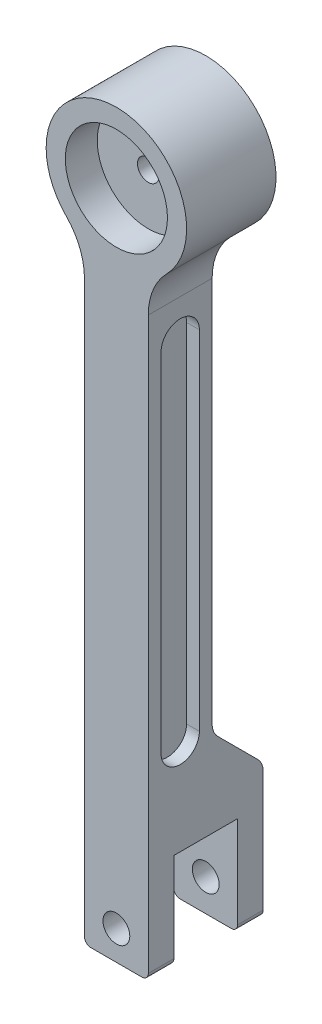
ISO-10303-21;
HEADER;
FILE_DESCRIPTION(('STEP AP214'),'2;1');
FILE_NAME('part.step','',(''),(''),'','','');
FILE_SCHEMA(('AUTOMOTIVE_DESIGN { 1 0 10303 214 1 1 1 1 }'));
ENDSEC;
DATA;
#1=APPLICATION_CONTEXT('core data for automotive mechanical design processes');
#2=APPLICATION_PROTOCOL_DEFINITION('international standard','automotive_design',2000,#1);
#3=PRODUCT_CONTEXT('',#1,'mechanical');
#4=PRODUCT('Part','Part','',(#3));
#5=PRODUCT_RELATED_PRODUCT_CATEGORY('part','',(#4));
#6=PRODUCT_DEFINITION_FORMATION('','',#4);
#7=PRODUCT_DEFINITION_CONTEXT('part definition',#1,'design');
#8=PRODUCT_DEFINITION('design','',#6,#7);
#9=PRODUCT_DEFINITION_SHAPE('','',#8);
#10=(LENGTH_UNIT() NAMED_UNIT(*) SI_UNIT(.MILLI.,.METRE.));
#11=(NAMED_UNIT(*) PLANE_ANGLE_UNIT() SI_UNIT($,.RADIAN.));
#12=(NAMED_UNIT(*) SI_UNIT($,.STERADIAN.) SOLID_ANGLE_UNIT());
#13=UNCERTAINTY_MEASURE_WITH_UNIT(LENGTH_MEASURE(1.E-05),#10,'distance_accuracy_value','');
#14=(GEOMETRIC_REPRESENTATION_CONTEXT(3) GLOBAL_UNCERTAINTY_ASSIGNED_CONTEXT((#13)) GLOBAL_UNIT_ASSIGNED_CONTEXT((#10,
#11,#12)) REPRESENTATION_CONTEXT('',''));
#15=CARTESIAN_POINT('',(0.,0.,0.));
#16=DIRECTION('',(0.,0.,1.));
#17=DIRECTION('',(1.,0.,0.));
#18=AXIS2_PLACEMENT_3D('',#15,#16,#17);
#19=CARTESIAN_POINT('',(-5.,105.001553241133,5.));
#20=DIRECTION('',(0.,0.,-1.));
#21=DIRECTION('',(-1.,0.,0.));
#22=AXIS2_PLACEMENT_3D('',#19,#20,#21);
#23=CYLINDRICAL_SURFACE('',#22,1.7);
#24=CARTESIAN_POINT('',(-5.,105.001553241133,5.));
#25=DIRECTION('',(0.,0.,1.));
#26=DIRECTION('',(1.,0.,0.));
#27=AXIS2_PLACEMENT_3D('',#24,#25,#26);
#28=CIRCLE('',#27,1.7);
#29=CARTESIAN_POINT('',(-3.3,105.001553241133,5.));
#30=VERTEX_POINT('',#29);
#31=EDGE_CURVE('E339',#30,#30,#28,.T.);
#32=ORIENTED_EDGE('',*,*,#31,.T.);
#33=EDGE_LOOP('',(#32));
#34=FACE_BOUND('',#33,.T.);
#35=CARTESIAN_POINT('',(-5.,105.001553241133,-3.));
#36=DIRECTION('',(0.,0.,-1.));
#37=DIRECTION('',(-1.,0.,0.));
#38=AXIS2_PLACEMENT_3D('',#35,#36,#37);
#39=CIRCLE('',#38,1.7);
#40=CARTESIAN_POINT('',(-6.7,105.001553241133,-3.));
#41=VERTEX_POINT('',#40);
#42=EDGE_CURVE('E252',#41,#41,#39,.T.);
#43=ORIENTED_EDGE('',*,*,#42,.T.);
#44=EDGE_LOOP('',(#43));
#45=FACE_BOUND('',#44,.T.);
#46=ADVANCED_FACE('F41',(#34,#45),#23,.F.);
#47=CARTESIAN_POINT('',(-10.,0.,10.));
#48=DIRECTION('',(-1.,0.,0.));
#49=DIRECTION('',(0.,0.,1.));
#50=AXIS2_PLACEMENT_3D('',#47,#48,#49);
#51=PLANE('',#50);
#52=DIRECTION('',(0.,1.,0.));
#53=VECTOR('',#52,1.);
#54=CARTESIAN_POINT('',(-10.,0.,-8.));
#55=LINE('',#54,#53);
#56=CARTESIAN_POINT('',(-10.,0.596931931651663,-8.));
#57=VERTEX_POINT('',#56);
#58=CARTESIAN_POINT('',(-10.,19.3542912445324,-8.));
#59=VERTEX_POINT('',#58);
#60=EDGE_CURVE('E317',#57,#59,#55,.T.);
#61=ORIENTED_EDGE('',*,*,#60,.F.);
#62=DIRECTION('',(0.,0.,-1.));
#63=VECTOR('',#62,1.);
#64=CARTESIAN_POINT('',(-10.,0.596931931651663,10.));
#65=LINE('',#64,#63);
#66=CARTESIAN_POINT('',(-10.,0.596931931651663,-4.));
#67=VERTEX_POINT('',#66);
#68=EDGE_CURVE('E431',#57,#67,#65,.F.);
#69=ORIENTED_EDGE('',*,*,#68,.T.);
#70=DIRECTION('',(0.,1.,0.));
#71=VECTOR('',#70,1.);
#72=CARTESIAN_POINT('',(-10.,0.,-4.));
#73=LINE('',#72,#71);
#74=CARTESIAN_POINT('',(-10.,18.,-4.));
#75=VERTEX_POINT('',#74);
#76=EDGE_CURVE('E309',#67,#75,#73,.T.);
#77=ORIENTED_EDGE('',*,*,#76,.T.);
#78=DIRECTION('',(0.,0.,1.));
#79=VECTOR('',#78,1.);
#80=CARTESIAN_POINT('',(-10.,18.,10.));
#81=LINE('',#80,#79);
#82=CARTESIAN_POINT('',(-10.,18.,6.));
#83=VERTEX_POINT('',#82);
#84=EDGE_CURVE('E412',#75,#83,#81,.T.);
#85=ORIENTED_EDGE('',*,*,#84,.T.);
#86=DIRECTION('',(0.,-1.,0.));
#87=VECTOR('',#86,1.);
#88=CARTESIAN_POINT('',(-10.,0.,6.));
#89=LINE('',#88,#87);
#90=CARTESIAN_POINT('',(-10.,0.999999999999999,6.));
#91=VERTEX_POINT('',#90);
#92=EDGE_CURVE('E306',#83,#91,#89,.T.);
#93=ORIENTED_EDGE('',*,*,#92,.T.);
#94=DIRECTION('',(0.,0.,-1.));
#95=VECTOR('',#94,1.);
#96=CARTESIAN_POINT('',(-10.,0.999999999999999,10.));
#97=LINE('',#96,#95);
#98=CARTESIAN_POINT('',(-10.,0.999999999999999,10.));
#99=VERTEX_POINT('',#98);
#100=EDGE_CURVE('E429',#91,#99,#97,.F.);
#101=ORIENTED_EDGE('',*,*,#100,.T.);
#102=DIRECTION('',(0.,1.,0.));
#103=VECTOR('',#102,1.);
#104=CARTESIAN_POINT('',(-10.,0.,10.));
#105=LINE('',#104,#103);
#106=CARTESIAN_POINT('',(-10.,90.3046147844336,10.));
#107=VERTEX_POINT('',#106);
#108=EDGE_CURVE('E350',#99,#107,#105,.T.);
#109=ORIENTED_EDGE('',*,*,#108,.T.);
#110=DIRECTION('',(0.,0.,-1.));
#111=VECTOR('',#110,1.);
#112=CARTESIAN_POINT('',(-10.,90.3046147844336,10.));
#113=LINE('',#112,#111);
#114=CARTESIAN_POINT('',(-10.,90.3046147844336,0.));
#115=VERTEX_POINT('',#114);
#116=EDGE_CURVE('E363',#107,#115,#113,.T.);
#117=ORIENTED_EDGE('',*,*,#116,.T.);
#118=DIRECTION('',(0.,1.,0.));
#119=VECTOR('',#118,1.);
#120=CARTESIAN_POINT('',(-10.,0.,0.));
#121=LINE('',#120,#119);
#122=CARTESIAN_POINT('',(-10.,29.8395726187709,0.));
#123=VERTEX_POINT('',#122);
#124=EDGE_CURVE('E347',#123,#115,#121,.T.);
#125=ORIENTED_EDGE('',*,*,#124,.F.);
#126=CARTESIAN_POINT('',(-10.,29.8395726187709,-3.));
#127=DIRECTION('',(-1.,0.,0.));
#128=DIRECTION('',(0.,0.,1.));
#129=AXIS2_PLACEMENT_3D('',#126,#127,#128);
#130=CIRCLE('',#129,3.);
#131=CARTESIAN_POINT('',(-10.,27.7182522752113,-0.878679656440359));
#132=VERTEX_POINT('',#131);
#133=EDGE_CURVE('E405',#123,#132,#130,.F.);
#134=ORIENTED_EDGE('',*,*,#133,.T.);
#135=DIRECTION('',(0.,0.707106781186546,0.707106781186549));
#136=VECTOR('',#135,1.);
#137=CARTESIAN_POINT('',(-10.,14.2984659658259,-14.2984659658258));
#138=LINE('',#137,#136);
#139=CARTESIAN_POINT('',(-10.,21.475611588092,-7.12132034355964));
#140=VERTEX_POINT('',#139);
#141=EDGE_CURVE('E324',#140,#132,#138,.T.);
#142=ORIENTED_EDGE('',*,*,#141,.F.);
#143=CARTESIAN_POINT('',(-10.,19.3542912445324,-5.));
#144=DIRECTION('',(-1.,0.,0.));
#145=DIRECTION('',(0.,0.,1.));
#146=AXIS2_PLACEMENT_3D('',#143,#144,#145);
#147=CIRCLE('',#146,3.);
#148=EDGE_CURVE('E400',#140,#59,#147,.T.);
#149=ORIENTED_EDGE('',*,*,#148,.T.);
#150=EDGE_LOOP('',(#61,#69,#77,#85,#93,#101,#109,#117,#125,#134,#142,#149));
#151=FACE_BOUND('',#150,.T.);
#152=DIRECTION('',(0.,1.,0.));
#153=VECTOR('',#152,1.);
#154=CARTESIAN_POINT('',(-10.,29.8395726187709,2.));
#155=LINE('',#154,#153);
#156=CARTESIAN_POINT('',(-10.,29.8395726187709,2.));
#157=VERTEX_POINT('',#156);
#158=CARTESIAN_POINT('',(-10.,84.3046147844336,2.));
#159=VERTEX_POINT('',#158);
#160=EDGE_CURVE('E251',#157,#159,#155,.T.);
#161=ORIENTED_EDGE('',*,*,#160,.T.);
#162=CARTESIAN_POINT('',(-10.,84.3046147844336,5.));
#163=DIRECTION('',(1.,0.,0.));
#164=DIRECTION('',(0.,-1.,0.));
#165=AXIS2_PLACEMENT_3D('',#162,#163,#164);
#166=CIRCLE('',#165,3.);
#167=CARTESIAN_POINT('',(-10.,84.3046147844336,8.));
#168=VERTEX_POINT('',#167);
#169=EDGE_CURVE('E56',#159,#168,#166,.T.);
#170=ORIENTED_EDGE('',*,*,#169,.T.);
#171=DIRECTION('',(0.,-1.,0.));
#172=VECTOR('',#171,1.);
#173=CARTESIAN_POINT('',(-10.,29.8395726187709,8.));
#174=LINE('',#173,#172);
#175=CARTESIAN_POINT('',(-10.,29.8395726187709,8.));
#176=VERTEX_POINT('',#175);
#177=EDGE_CURVE('E240',#168,#176,#174,.T.);
#178=ORIENTED_EDGE('',*,*,#177,.T.);
#179=CARTESIAN_POINT('',(-10.,29.8395726187709,5.));
#180=DIRECTION('',(1.,0.,0.));
#181=DIRECTION('',(0.,1.,0.));
#182=AXIS2_PLACEMENT_3D('',#179,#180,#181);
#183=CIRCLE('',#182,3.);
#184=EDGE_CURVE('E243',#176,#157,#183,.T.);
#185=ORIENTED_EDGE('',*,*,#184,.T.);
#186=EDGE_LOOP('',(#161,#170,#178,#185));
#187=FACE_BOUND('',#186,.T.);
#188=ADVANCED_FACE('F489',(#151,#187),#51,.T.);
#189=CARTESIAN_POINT('',(0.,0.,10.));
#190=DIRECTION('',(-1.,0.,0.));
#191=DIRECTION('',(0.,-1.,0.));
#192=AXIS2_PLACEMENT_3D('',#189,#190,#191);
#193=PLANE('',#192);
#194=DIRECTION('',(0.,-1.,0.));
#195=VECTOR('',#194,1.);
#196=CARTESIAN_POINT('',(0.,29.8395726187709,8.));
#197=LINE('',#196,#195);
#198=CARTESIAN_POINT('',(0.,84.3046147844336,8.));
#199=VERTEX_POINT('',#198);
#200=CARTESIAN_POINT('',(0.,29.8395726187709,8.));
#201=VERTEX_POINT('',#200);
#202=EDGE_CURVE('E276',#199,#201,#197,.T.);
#203=ORIENTED_EDGE('',*,*,#202,.F.);
#204=CARTESIAN_POINT('',(0.,84.3046147844336,5.));
#205=DIRECTION('',(1.,0.,0.));
#206=DIRECTION('',(0.,-1.,0.));
#207=AXIS2_PLACEMENT_3D('',#204,#205,#206);
#208=CIRCLE('',#207,3.);
#209=CARTESIAN_POINT('',(0.,84.3046147844336,2.));
#210=VERTEX_POINT('',#209);
#211=EDGE_CURVE('E64',#210,#199,#208,.T.);
#212=ORIENTED_EDGE('',*,*,#211,.F.);
#213=DIRECTION('',(0.,1.,0.));
#214=VECTOR('',#213,1.);
#215=CARTESIAN_POINT('',(0.,29.8395726187709,2.));
#216=LINE('',#215,#214);
#217=CARTESIAN_POINT('',(0.,29.8395726187709,2.));
#218=VERTEX_POINT('',#217);
#219=EDGE_CURVE('E265',#218,#210,#216,.T.);
#220=ORIENTED_EDGE('',*,*,#219,.F.);
#221=CARTESIAN_POINT('',(0.,29.8395726187709,5.));
#222=DIRECTION('',(1.,0.,0.));
#223=DIRECTION('',(0.,1.,0.));
#224=AXIS2_PLACEMENT_3D('',#221,#222,#223);
#225=CIRCLE('',#224,3.);
#226=EDGE_CURVE('E279',#201,#218,#225,.T.);
#227=ORIENTED_EDGE('',*,*,#226,.F.);
#228=EDGE_LOOP('',(#203,#212,#220,#227));
#229=FACE_BOUND('',#228,.T.);
#230=DIRECTION('',(0.,1.,0.));
#231=VECTOR('',#230,1.);
#232=CARTESIAN_POINT('',(0.,0.,-4.));
#233=LINE('',#232,#231);
#234=CARTESIAN_POINT('',(0.,0.596931931651663,-4.));
#235=VERTEX_POINT('',#234);
#236=CARTESIAN_POINT('',(0.,15.,-4.));
#237=VERTEX_POINT('',#236);
#238=EDGE_CURVE('E310',#235,#237,#233,.T.);
#239=ORIENTED_EDGE('',*,*,#238,.F.);
#240=DIRECTION('',(0.,0.,-1.));
#241=VECTOR('',#240,1.);
#242=CARTESIAN_POINT('',(0.,0.596931931651663,-8.));
#243=LINE('',#242,#241);
#244=CARTESIAN_POINT('',(0.,0.596931931651663,-8.));
#245=VERTEX_POINT('',#244);
#246=EDGE_CURVE('E440',#235,#245,#243,.T.);
#247=ORIENTED_EDGE('',*,*,#246,.T.);
#248=DIRECTION('',(0.,1.,0.));
#249=VECTOR('',#248,1.);
#250=CARTESIAN_POINT('',(0.,0.,-8.));
#251=LINE('',#250,#249);
#252=CARTESIAN_POINT('',(0.,19.3542912445324,-8.));
#253=VERTEX_POINT('',#252);
#254=EDGE_CURVE('E321',#245,#253,#251,.T.);
#255=ORIENTED_EDGE('',*,*,#254,.T.);
#256=CARTESIAN_POINT('',(0.,19.3542912445324,-5.));
#257=DIRECTION('',(-1.,0.,0.));
#258=DIRECTION('',(0.,-1.,0.));
#259=AXIS2_PLACEMENT_3D('',#256,#257,#258);
#260=CIRCLE('',#259,3.);
#261=CARTESIAN_POINT('',(0.,21.475611588092,-7.12132034355964));
#262=VERTEX_POINT('',#261);
#263=EDGE_CURVE('E398',#253,#262,#260,.F.);
#264=ORIENTED_EDGE('',*,*,#263,.T.);
#265=DIRECTION('',(0.,0.707106781186546,0.707106781186549));
#266=VECTOR('',#265,1.);
#267=CARTESIAN_POINT('',(0.,14.2984659658259,-14.2984659658258));
#268=LINE('',#267,#266);
#269=CARTESIAN_POINT('',(0.,27.7182522752113,-0.878679656440359));
#270=VERTEX_POINT('',#269);
#271=EDGE_CURVE('E318',#262,#270,#268,.T.);
#272=ORIENTED_EDGE('',*,*,#271,.T.);
#273=CARTESIAN_POINT('',(0.,29.8395726187709,-3.));
#274=DIRECTION('',(-1.,0.,0.));
#275=DIRECTION('',(0.,-1.,0.));
#276=AXIS2_PLACEMENT_3D('',#273,#274,#275);
#277=CIRCLE('',#276,3.);
#278=CARTESIAN_POINT('',(0.,29.8395726187709,0.));
#279=VERTEX_POINT('',#278);
#280=EDGE_CURVE('E403',#270,#279,#277,.T.);
#281=ORIENTED_EDGE('',*,*,#280,.T.);
#282=DIRECTION('',(0.,1.,0.));
#283=VECTOR('',#282,1.);
#284=CARTESIAN_POINT('',(0.,0.,0.));
#285=LINE('',#284,#283);
#286=CARTESIAN_POINT('',(0.,90.3046147844336,0.));
#287=VERTEX_POINT('',#286);
#288=EDGE_CURVE('E343',#279,#287,#285,.T.);
#289=ORIENTED_EDGE('',*,*,#288,.T.);
#290=DIRECTION('',(0.,0.,1.));
#291=VECTOR('',#290,1.);
#292=CARTESIAN_POINT('',(0.,90.3046147844336,10.));
#293=LINE('',#292,#291);
#294=CARTESIAN_POINT('',(0.,90.3046147844336,10.));
#295=VERTEX_POINT('',#294);
#296=EDGE_CURVE('E371',#287,#295,#293,.T.);
#297=ORIENTED_EDGE('',*,*,#296,.T.);
#298=DIRECTION('',(0.,1.,0.));
#299=VECTOR('',#298,1.);
#300=CARTESIAN_POINT('',(0.,0.,10.));
#301=LINE('',#300,#299);
#302=CARTESIAN_POINT('',(0.,1.,10.));
#303=VERTEX_POINT('',#302);
#304=EDGE_CURVE('E344',#303,#295,#301,.T.);
#305=ORIENTED_EDGE('',*,*,#304,.F.);
#306=DIRECTION('',(0.,0.,-1.));
#307=VECTOR('',#306,1.);
#308=CARTESIAN_POINT('',(0.,1.,6.));
#309=LINE('',#308,#307);
#310=CARTESIAN_POINT('',(0.,1.,6.));
#311=VERTEX_POINT('',#310);
#312=EDGE_CURVE('E437',#303,#311,#309,.T.);
#313=ORIENTED_EDGE('',*,*,#312,.T.);
#314=DIRECTION('',(0.,1.,0.));
#315=VECTOR('',#314,1.);
#316=CARTESIAN_POINT('',(0.,0.,6.));
#317=LINE('',#316,#315);
#318=CARTESIAN_POINT('',(0.,15.,6.));
#319=VERTEX_POINT('',#318);
#320=EDGE_CURVE('E301',#311,#319,#317,.T.);
#321=ORIENTED_EDGE('',*,*,#320,.T.);
#322=DIRECTION('',(0.,0.,-1.));
#323=VECTOR('',#322,1.);
#324=CARTESIAN_POINT('',(0.,15.,0.));
#325=LINE('',#324,#323);
#326=EDGE_CURVE('E314',#319,#237,#325,.T.);
#327=ORIENTED_EDGE('',*,*,#326,.T.);
#328=EDGE_LOOP('',(#239,#247,#255,#264,#272,#281,#289,#297,#305,#313,#321,#327));
#329=FACE_BOUND('',#328,.T.);
#330=ADVANCED_FACE('F495',(#229,#329),#193,.F.);
#331=CARTESIAN_POINT('',(0.,0.,10.));
#332=DIRECTION('',(0.,-1.,0.));
#333=DIRECTION('',(1.,0.,0.));
#334=AXIS2_PLACEMENT_3D('',#331,#332,#333);
#335=PLANE('',#334);
#336=DIRECTION('',(-1.,0.,0.));
#337=VECTOR('',#336,1.);
#338=CARTESIAN_POINT('',(0.,0.,10.));
#339=LINE('',#338,#337);
#340=CARTESIAN_POINT('',(-1.,0.,10.));
#341=VERTEX_POINT('',#340);
#342=CARTESIAN_POINT('',(-9.,0.,10.));
#343=VERTEX_POINT('',#342);
#344=EDGE_CURVE('E352',#341,#343,#339,.T.);
#345=ORIENTED_EDGE('',*,*,#344,.T.);
#346=DIRECTION('',(0.,0.,-1.));
#347=VECTOR('',#346,1.);
#348=CARTESIAN_POINT('',(-9.,0.,10.));
#349=LINE('',#348,#347);
#350=CARTESIAN_POINT('',(-9.,0.,6.));
#351=VERTEX_POINT('',#350);
#352=EDGE_CURVE('E445',#343,#351,#349,.T.);
#353=ORIENTED_EDGE('',*,*,#352,.T.);
#354=DIRECTION('',(1.,0.,0.));
#355=VECTOR('',#354,1.);
#356=CARTESIAN_POINT('',(0.,0.,6.));
#357=LINE('',#356,#355);
#358=CARTESIAN_POINT('',(-1.,0.,6.));
#359=VERTEX_POINT('',#358);
#360=EDGE_CURVE('E385',#351,#359,#357,.T.);
#361=ORIENTED_EDGE('',*,*,#360,.T.);
#362=DIRECTION('',(0.,0.,-1.));
#363=VECTOR('',#362,1.);
#364=CARTESIAN_POINT('',(-1.,0.,10.));
#365=LINE('',#364,#363);
#366=EDGE_CURVE('E443',#359,#341,#365,.F.);
#367=ORIENTED_EDGE('',*,*,#366,.T.);
#368=EDGE_LOOP('',(#345,#353,#361,#367));
#369=FACE_BOUND('',#368,.T.);
#370=ADVANCED_FACE('F483',(#369),#335,.T.);
#371=CARTESIAN_POINT('',(0.,0.,0.));
#372=DIRECTION('',(0.,0.,1.));
#373=DIRECTION('',(1.,0.,0.));
#374=AXIS2_PLACEMENT_3D('',#371,#372,#373);
#375=PLANE('',#374);
#376=ORIENTED_EDGE('',*,*,#288,.F.);
#377=DIRECTION('',(1.,0.,0.));
#378=VECTOR('',#377,1.);
#379=CARTESIAN_POINT('',(0.,29.8395726187709,0.));
#380=LINE('',#379,#378);
#381=EDGE_CURVE('E393',#279,#123,#380,.F.);
#382=ORIENTED_EDGE('',*,*,#381,.T.);
#383=ORIENTED_EDGE('',*,*,#124,.T.);
#384=CARTESIAN_POINT('',(-20.,90.3046147844336,0.));
#385=DIRECTION('',(0.,0.,1.));
#386=DIRECTION('',(1.,0.,0.));
#387=AXIS2_PLACEMENT_3D('',#384,#385,#386);
#388=CIRCLE('',#387,10.);
#389=CARTESIAN_POINT('',(-12.8571428571429,97.3031569066713,0.));
#390=VERTEX_POINT('',#389);
#391=EDGE_CURVE('E374',#115,#390,#388,.T.);
#392=ORIENTED_EDGE('',*,*,#391,.T.);
#393=CARTESIAN_POINT('',(-5.,105.001553241133,0.));
#394=DIRECTION('',(0.,0.,-1.));
#395=DIRECTION('',(-1.,0.,0.));
#396=AXIS2_PLACEMENT_3D('',#393,#394,#395);
#397=CIRCLE('',#396,11.);
#398=CARTESIAN_POINT('',(2.85714285714285,97.3031569066713,0.));
#399=VERTEX_POINT('',#398);
#400=EDGE_CURVE('E335',#399,#390,#397,.T.);
#401=ORIENTED_EDGE('',*,*,#400,.F.);
#402=CARTESIAN_POINT('',(10.,90.3046147844336,0.));
#403=DIRECTION('',(0.,0.,1.));
#404=DIRECTION('',(1.,0.,0.));
#405=AXIS2_PLACEMENT_3D('',#402,#403,#404);
#406=CIRCLE('',#405,10.);
#407=EDGE_CURVE('E380',#399,#287,#406,.T.);
#408=ORIENTED_EDGE('',*,*,#407,.T.);
#409=EDGE_LOOP('',(#376,#382,#383,#392,#401,#408));
#410=FACE_BOUND('',#409,.T.);
#411=ADVANCED_FACE('F473',(#410),#375,.F.);
#412=CARTESIAN_POINT('',(-5.,105.001553241133,10.));
#413=DIRECTION('',(0.,0.,-1.));
#414=DIRECTION('',(-1.,0.,0.));
#415=AXIS2_PLACEMENT_3D('',#412,#413,#414);
#416=CYLINDRICAL_SURFACE('',#415,11.);
#417=ORIENTED_EDGE('',*,*,#400,.T.);
#418=DIRECTION('',(0.,0.,-1.));
#419=VECTOR('',#418,1.);
#420=CARTESIAN_POINT('',(-12.8571428571429,97.3031569066713,10.));
#421=LINE('',#420,#419);
#422=CARTESIAN_POINT('',(-12.8571428571429,97.3031569066713,10.));
#423=VERTEX_POINT('',#422);
#424=EDGE_CURVE('E369',#390,#423,#421,.F.);
#425=ORIENTED_EDGE('',*,*,#424,.T.);
#426=CARTESIAN_POINT('',(-5.,105.001553241133,10.));
#427=DIRECTION('',(0.,0.,1.));
#428=DIRECTION('',(1.,0.,0.));
#429=AXIS2_PLACEMENT_3D('',#426,#427,#428);
#430=CIRCLE('',#429,11.);
#431=CARTESIAN_POINT('',(2.85714285714286,97.3031569066713,10.));
#432=VERTEX_POINT('',#431);
#433=EDGE_CURVE('E346',#432,#423,#430,.T.);
#434=ORIENTED_EDGE('',*,*,#433,.F.);
#435=DIRECTION('',(0.,0.,-1.));
#436=VECTOR('',#435,1.);
#437=CARTESIAN_POINT('',(2.85714285714286,97.3031569066713,10.));
#438=LINE('',#437,#436);
#439=EDGE_CURVE('E366',#432,#399,#438,.T.);
#440=ORIENTED_EDGE('',*,*,#439,.T.);
#441=EDGE_LOOP('',(#417,#425,#434,#440));
#442=FACE_BOUND('',#441,.T.);
#443=CARTESIAN_POINT('',(-5.,105.001553241133,-4.));
#444=DIRECTION('',(0.,0.,-1.));
#445=DIRECTION('',(-1.,0.,0.));
#446=AXIS2_PLACEMENT_3D('',#443,#444,#445);
#447=CIRCLE('',#446,11.);
#448=CARTESIAN_POINT('',(-16.,105.001553241133,-4.));
#449=VERTEX_POINT('',#448);
#450=EDGE_CURVE('E336',#449,#449,#447,.T.);
#451=ORIENTED_EDGE('',*,*,#450,.F.);
#452=EDGE_LOOP('',(#451));
#453=FACE_BOUND('',#452,.T.);
#454=ADVANCED_FACE('F470',(#442,#453),#416,.T.);
#455=CARTESIAN_POINT('',(-5.,105.001553241133,10.));
#456=DIRECTION('',(0.,0.,-1.));
#457=DIRECTION('',(-1.,0.,0.));
#458=AXIS2_PLACEMENT_3D('',#455,#456,#457);
#459=CYLINDRICAL_SURFACE('',#458,8.);
#460=CARTESIAN_POINT('',(-5.,105.001553241133,5.));
#461=DIRECTION('',(0.,0.,1.));
#462=DIRECTION('',(1.,0.,0.));
#463=AXIS2_PLACEMENT_3D('',#460,#461,#462);
#464=CIRCLE('',#463,8.);
#465=CARTESIAN_POINT('',(3.,105.001553241133,5.));
#466=VERTEX_POINT('',#465);
#467=EDGE_CURVE('E358',#466,#466,#464,.T.);
#468=ORIENTED_EDGE('',*,*,#467,.F.);
#469=EDGE_LOOP('',(#468));
#470=FACE_BOUND('',#469,.T.);
#471=CARTESIAN_POINT('',(-5.,105.001553241133,10.));
#472=DIRECTION('',(0.,0.,1.));
#473=DIRECTION('',(1.,0.,0.));
#474=AXIS2_PLACEMENT_3D('',#471,#472,#473);
#475=CIRCLE('',#474,8.);
#476=CARTESIAN_POINT('',(3.,105.001553241133,10.));
#477=VERTEX_POINT('',#476);
#478=EDGE_CURVE('E355',#477,#477,#475,.T.);
#479=ORIENTED_EDGE('',*,*,#478,.T.);
#480=EDGE_LOOP('',(#479));
#481=FACE_BOUND('',#480,.T.);
#482=ADVANCED_FACE('F472',(#470,#481),#459,.F.);
#483=CARTESIAN_POINT('',(0.,0.,10.));
#484=DIRECTION('',(0.,0.,1.));
#485=DIRECTION('',(1.,0.,0.));
#486=AXIS2_PLACEMENT_3D('',#483,#484,#485);
#487=PLANE('',#486);
#488=CARTESIAN_POINT('',(-5.,4.59693193165166,10.));
#489=DIRECTION('',(0.,0.,1.));
#490=DIRECTION('',(1.,0.,0.));
#491=AXIS2_PLACEMENT_3D('',#488,#489,#490);
#492=CIRCLE('',#491,2.1);
#493=CARTESIAN_POINT('',(-2.9,4.59693193165166,10.));
#494=VERTEX_POINT('',#493);
#495=EDGE_CURVE('E286',#494,#494,#492,.T.);
#496=ORIENTED_EDGE('',*,*,#495,.F.);
#497=EDGE_LOOP('',(#496));
#498=FACE_BOUND('',#497,.T.);
#499=ORIENTED_EDGE('',*,*,#108,.F.);
#500=CARTESIAN_POINT('',(-9.,0.999999999999999,10.));
#501=DIRECTION('',(0.,0.,1.));
#502=DIRECTION('',(1.,0.,0.));
#503=AXIS2_PLACEMENT_3D('',#500,#501,#502);
#504=CIRCLE('',#503,1.);
#505=EDGE_CURVE('E49',#99,#343,#504,.T.);
#506=ORIENTED_EDGE('',*,*,#505,.T.);
#507=ORIENTED_EDGE('',*,*,#344,.F.);
#508=CARTESIAN_POINT('',(-1.,1.,10.));
#509=DIRECTION('',(0.,0.,1.));
#510=DIRECTION('',(1.,0.,0.));
#511=AXIS2_PLACEMENT_3D('',#508,#509,#510);
#512=CIRCLE('',#511,1.);
#513=EDGE_CURVE('E452',#341,#303,#512,.T.);
#514=ORIENTED_EDGE('',*,*,#513,.T.);
#515=ORIENTED_EDGE('',*,*,#304,.T.);
#516=CARTESIAN_POINT('',(10.,90.3046147844336,10.));
#517=DIRECTION('',(0.,0.,1.));
#518=DIRECTION('',(1.,0.,0.));
#519=AXIS2_PLACEMENT_3D('',#516,#517,#518);
#520=CIRCLE('',#519,10.);
#521=EDGE_CURVE('E383',#295,#432,#520,.F.);
#522=ORIENTED_EDGE('',*,*,#521,.T.);
#523=ORIENTED_EDGE('',*,*,#433,.T.);
#524=CARTESIAN_POINT('',(-20.,90.3046147844336,10.));
#525=DIRECTION('',(0.,0.,1.));
#526=DIRECTION('',(1.,0.,0.));
#527=AXIS2_PLACEMENT_3D('',#524,#525,#526);
#528=CIRCLE('',#527,10.);
#529=EDGE_CURVE('E377',#423,#107,#528,.F.);
#530=ORIENTED_EDGE('',*,*,#529,.T.);
#531=EDGE_LOOP('',(#499,#506,#507,#514,#515,#522,#523,#530));
#532=FACE_BOUND('',#531,.T.);
#533=ORIENTED_EDGE('',*,*,#478,.F.);
#534=EDGE_LOOP('',(#533));
#535=FACE_BOUND('',#534,.T.);
#536=ADVANCED_FACE('F480',(#498,#532,#535),#487,.T.);
#537=CARTESIAN_POINT('',(0.,0.,5.));
#538=DIRECTION('',(0.,0.,1.));
#539=DIRECTION('',(1.,0.,0.));
#540=AXIS2_PLACEMENT_3D('',#537,#538,#539);
#541=PLANE('',#540);
#542=ORIENTED_EDGE('',*,*,#31,.F.);
#543=EDGE_LOOP('',(#542));
#544=FACE_BOUND('',#543,.T.);
#545=ORIENTED_EDGE('',*,*,#467,.T.);
#546=EDGE_LOOP('',(#545));
#547=FACE_BOUND('',#546,.T.);
#548=ADVANCED_FACE('F466',(#544,#547),#541,.T.);
#549=CARTESIAN_POINT('',(-5.,105.001553241133,-4.));
#550=DIRECTION('',(0.,0.,-1.));
#551=DIRECTION('',(-1.,0.,0.));
#552=AXIS2_PLACEMENT_3D('',#549,#550,#551);
#553=PLANE('',#552);
#554=CARTESIAN_POINT('',(-5.,105.001553241133,-4.));
#555=DIRECTION('',(0.,0.,-1.));
#556=DIRECTION('',(-1.,0.,0.));
#557=AXIS2_PLACEMENT_3D('',#554,#555,#556);
#558=CIRCLE('',#557,4.5);
#559=CARTESIAN_POINT('',(-9.5,105.001553241133,-4.));
#560=VERTEX_POINT('',#559);
#561=EDGE_CURVE('E246',#560,#560,#558,.T.);
#562=ORIENTED_EDGE('',*,*,#561,.F.);
#563=EDGE_LOOP('',(#562));
#564=FACE_BOUND('',#563,.T.);
#565=ORIENTED_EDGE('',*,*,#450,.T.);
#566=EDGE_LOOP('',(#565));
#567=FACE_BOUND('',#566,.T.);
#568=ADVANCED_FACE('F462',(#564,#567),#553,.T.);
#569=CARTESIAN_POINT('',(-20.,90.3046147844336,10.));
#570=DIRECTION('',(0.,0.,-1.));
#571=DIRECTION('',(-1.,0.,0.));
#572=AXIS2_PLACEMENT_3D('',#569,#570,#571);
#573=CYLINDRICAL_SURFACE('',#572,10.);
#574=ORIENTED_EDGE('',*,*,#529,.F.);
#575=ORIENTED_EDGE('',*,*,#424,.F.);
#576=ORIENTED_EDGE('',*,*,#391,.F.);
#577=ORIENTED_EDGE('',*,*,#116,.F.);
#578=EDGE_LOOP('',(#574,#575,#576,#577));
#579=FACE_BOUND('',#578,.T.);
#580=ADVANCED_FACE('F465',(#579),#573,.F.);
#581=CARTESIAN_POINT('',(10.,90.3046147844336,10.));
#582=DIRECTION('',(0.,0.,-1.));
#583=DIRECTION('',(-1.,0.,0.));
#584=AXIS2_PLACEMENT_3D('',#581,#582,#583);
#585=CYLINDRICAL_SURFACE('',#584,10.);
#586=ORIENTED_EDGE('',*,*,#521,.F.);
#587=ORIENTED_EDGE('',*,*,#296,.F.);
#588=ORIENTED_EDGE('',*,*,#407,.F.);
#589=ORIENTED_EDGE('',*,*,#439,.F.);
#590=EDGE_LOOP('',(#586,#587,#588,#589));
#591=FACE_BOUND('',#590,.T.);
#592=ADVANCED_FACE('F549',(#591),#585,.F.);
#593=CARTESIAN_POINT('',(-40.0832179129826,0.,-8.));
#594=DIRECTION('',(0.,0.,-1.));
#595=DIRECTION('',(-1.,0.,0.));
#596=AXIS2_PLACEMENT_3D('',#593,#594,#595);
#597=PLANE('',#596);
#598=CARTESIAN_POINT('',(-5.,4.59693193165166,-8.));
#599=DIRECTION('',(0.,0.,1.));
#600=DIRECTION('',(1.,0.,0.));
#601=AXIS2_PLACEMENT_3D('',#598,#599,#600);
#602=CIRCLE('',#601,2.1);
#603=CARTESIAN_POINT('',(-2.9,4.59693193165166,-8.));
#604=VERTEX_POINT('',#603);
#605=EDGE_CURVE('E292',#604,#604,#602,.T.);
#606=ORIENTED_EDGE('',*,*,#605,.T.);
#607=EDGE_LOOP('',(#606));
#608=FACE_BOUND('',#607,.T.);
#609=DIRECTION('',(1.,0.,0.));
#610=VECTOR('',#609,1.);
#611=CARTESIAN_POINT('',(-40.0832179129826,-0.403068068348337,-8.));
#612=LINE('',#611,#610);
#613=CARTESIAN_POINT('',(-9.,-0.403068068348337,-8.));
#614=VERTEX_POINT('',#613);
#615=CARTESIAN_POINT('',(-1.,-0.403068068348337,-8.));
#616=VERTEX_POINT('',#615);
#617=EDGE_CURVE('E312',#614,#616,#612,.T.);
#618=ORIENTED_EDGE('',*,*,#617,.F.);
#619=CARTESIAN_POINT('',(-9.,0.596931931651663,-8.));
#620=DIRECTION('',(0.,0.,-1.));
#621=DIRECTION('',(-1.,0.,0.));
#622=AXIS2_PLACEMENT_3D('',#619,#620,#621);
#623=CIRCLE('',#622,1.);
#624=EDGE_CURVE('E427',#614,#57,#623,.T.);
#625=ORIENTED_EDGE('',*,*,#624,.T.);
#626=ORIENTED_EDGE('',*,*,#60,.T.);
#627=DIRECTION('',(1.,0.,0.));
#628=VECTOR('',#627,1.);
#629=CARTESIAN_POINT('',(-40.0832179129826,19.3542912445324,-8.));
#630=LINE('',#629,#628);
#631=EDGE_CURVE('E395',#59,#253,#630,.T.);
#632=ORIENTED_EDGE('',*,*,#631,.T.);
#633=ORIENTED_EDGE('',*,*,#254,.F.);
#634=CARTESIAN_POINT('',(-1.,0.596931931651663,-8.));
#635=DIRECTION('',(0.,0.,-1.));
#636=DIRECTION('',(-1.,0.,0.));
#637=AXIS2_PLACEMENT_3D('',#634,#635,#636);
#638=CIRCLE('',#637,1.);
#639=EDGE_CURVE('E425',#245,#616,#638,.T.);
#640=ORIENTED_EDGE('',*,*,#639,.T.);
#641=EDGE_LOOP('',(#618,#625,#626,#632,#633,#640));
#642=FACE_BOUND('',#641,.T.);
#643=ADVANCED_FACE('F575',(#608,#642),#597,.T.);
#644=CARTESIAN_POINT('',(-40.0832179129826,14.2984659658259,-14.2984659658258));
#645=DIRECTION('',(0.,0.707106781186549,-0.707106781186546));
#646=DIRECTION('',(0.,0.707106781186546,0.707106781186549));
#647=AXIS2_PLACEMENT_3D('',#644,#645,#646);
#648=PLANE('',#647);
#649=ORIENTED_EDGE('',*,*,#141,.T.);
#650=DIRECTION('',(1.,0.,0.));
#651=VECTOR('',#650,1.);
#652=CARTESIAN_POINT('',(-40.0832179129826,27.7182522752113,-0.878679656440362));
#653=LINE('',#652,#651);
#654=EDGE_CURVE('E390',#132,#270,#653,.T.);
#655=ORIENTED_EDGE('',*,*,#654,.T.);
#656=ORIENTED_EDGE('',*,*,#271,.F.);
#657=DIRECTION('',(1.,0.,0.));
#658=VECTOR('',#657,1.);
#659=CARTESIAN_POINT('',(-40.0832179129826,21.475611588092,-7.12132034355964));
#660=LINE('',#659,#658);
#661=EDGE_CURVE('E388',#262,#140,#660,.F.);
#662=ORIENTED_EDGE('',*,*,#661,.T.);
#663=EDGE_LOOP('',(#649,#655,#656,#662));
#664=FACE_BOUND('',#663,.T.);
#665=ADVANCED_FACE('F565',(#664),#648,.T.);
#666=CARTESIAN_POINT('',(-40.0832179129826,15.,0.));
#667=DIRECTION('',(0.,-1.,0.));
#668=DIRECTION('',(0.,0.,-1.));
#669=AXIS2_PLACEMENT_3D('',#666,#667,#668);
#670=PLANE('',#669);
#671=DIRECTION('',(1.,0.,0.));
#672=VECTOR('',#671,1.);
#673=CARTESIAN_POINT('',(-16.,15.,6.));
#674=LINE('',#673,#672);
#675=CARTESIAN_POINT('',(-7.00000000000001,15.,6.));
#676=VERTEX_POINT('',#675);
#677=EDGE_CURVE('E303',#676,#319,#674,.T.);
#678=ORIENTED_EDGE('',*,*,#677,.F.);
#679=DIRECTION('',(0.,0.,-1.));
#680=VECTOR('',#679,1.);
#681=CARTESIAN_POINT('',(-7.00000000000001,15.,0.));
#682=LINE('',#681,#680);
#683=CARTESIAN_POINT('',(-7.00000000000001,15.,-4.));
#684=VERTEX_POINT('',#683);
#685=EDGE_CURVE('E407',#676,#684,#682,.T.);
#686=ORIENTED_EDGE('',*,*,#685,.T.);
#687=DIRECTION('',(1.,0.,0.));
#688=VECTOR('',#687,1.);
#689=CARTESIAN_POINT('',(-40.0832179129826,15.,-4.));
#690=LINE('',#689,#688);
#691=EDGE_CURVE('E328',#684,#237,#690,.T.);
#692=ORIENTED_EDGE('',*,*,#691,.T.);
#693=ORIENTED_EDGE('',*,*,#326,.F.);
#694=EDGE_LOOP('',(#678,#686,#692,#693));
#695=FACE_BOUND('',#694,.T.);
#696=ADVANCED_FACE('F533',(#695),#670,.T.);
#697=CARTESIAN_POINT('',(-40.0832179129826,0.,-4.));
#698=DIRECTION('',(0.,0.,-1.));
#699=DIRECTION('',(-1.,0.,0.));
#700=AXIS2_PLACEMENT_3D('',#697,#698,#699);
#701=PLANE('',#700);
#702=CARTESIAN_POINT('',(-5.,4.59693193165166,-4.));
#703=DIRECTION('',(0.,0.,-1.));
#704=DIRECTION('',(-1.,0.,0.));
#705=AXIS2_PLACEMENT_3D('',#702,#703,#704);
#706=CIRCLE('',#705,2.1);
#707=CARTESIAN_POINT('',(-7.1,4.59693193165166,-4.));
#708=VERTEX_POINT('',#707);
#709=EDGE_CURVE('E298',#708,#708,#706,.T.);
#710=ORIENTED_EDGE('',*,*,#709,.T.);
#711=EDGE_LOOP('',(#710));
#712=FACE_BOUND('',#711,.T.);
#713=ORIENTED_EDGE('',*,*,#76,.F.);
#714=CARTESIAN_POINT('',(-9.,0.596931931651663,-4.));
#715=DIRECTION('',(0.,0.,-1.));
#716=DIRECTION('',(-1.,0.,0.));
#717=AXIS2_PLACEMENT_3D('',#714,#715,#716);
#718=CIRCLE('',#717,1.);
#719=CARTESIAN_POINT('',(-9.,-0.403068068348337,-4.));
#720=VERTEX_POINT('',#719);
#721=EDGE_CURVE('E435',#67,#720,#718,.F.);
#722=ORIENTED_EDGE('',*,*,#721,.T.);
#723=DIRECTION('',(1.,0.,0.));
#724=VECTOR('',#723,1.);
#725=CARTESIAN_POINT('',(-40.0832179129826,-0.403068068348337,-4.));
#726=LINE('',#725,#724);
#727=CARTESIAN_POINT('',(-1.,-0.403068068348337,-4.));
#728=VERTEX_POINT('',#727);
#729=EDGE_CURVE('E313',#720,#728,#726,.T.);
#730=ORIENTED_EDGE('',*,*,#729,.T.);
#731=CARTESIAN_POINT('',(-1.,0.596931931651663,-4.));
#732=DIRECTION('',(0.,0.,-1.));
#733=DIRECTION('',(-1.,0.,0.));
#734=AXIS2_PLACEMENT_3D('',#731,#732,#733);
#735=CIRCLE('',#734,1.);
#736=EDGE_CURVE('E433',#728,#235,#735,.F.);
#737=ORIENTED_EDGE('',*,*,#736,.T.);
#738=ORIENTED_EDGE('',*,*,#238,.T.);
#739=ORIENTED_EDGE('',*,*,#691,.F.);
#740=DIRECTION('',(0.707106781186546,-0.707106781186549,0.));
#741=VECTOR('',#740,1.);
#742=CARTESIAN_POINT('',(-16.0416089564912,24.0416089564913,-4.));
#743=LINE('',#742,#741);
#744=EDGE_CURVE('E415',#684,#75,#743,.F.);
#745=ORIENTED_EDGE('',*,*,#744,.T.);
#746=EDGE_LOOP('',(#713,#722,#730,#737,#738,#739,#745));
#747=FACE_BOUND('',#746,.T.);
#748=ADVANCED_FACE('F583',(#712,#747),#701,.F.);
#749=CARTESIAN_POINT('',(-40.0832179129826,-0.403068068348337,0.));
#750=DIRECTION('',(0.,-1.,0.));
#751=DIRECTION('',(0.,0.,-1.));
#752=AXIS2_PLACEMENT_3D('',#749,#750,#751);
#753=PLANE('',#752);
#754=ORIENTED_EDGE('',*,*,#729,.F.);
#755=DIRECTION('',(0.,0.,-1.));
#756=VECTOR('',#755,1.);
#757=CARTESIAN_POINT('',(-9.,-0.403068068348337,0.));
#758=LINE('',#757,#756);
#759=EDGE_CURVE('E422',#720,#614,#758,.T.);
#760=ORIENTED_EDGE('',*,*,#759,.T.);
#761=ORIENTED_EDGE('',*,*,#617,.T.);
#762=DIRECTION('',(0.,0.,-1.));
#763=VECTOR('',#762,1.);
#764=CARTESIAN_POINT('',(-1.,-0.403068068348337,-4.));
#765=LINE('',#764,#763);
#766=EDGE_CURVE('E420',#616,#728,#765,.F.);
#767=ORIENTED_EDGE('',*,*,#766,.T.);
#768=EDGE_LOOP('',(#754,#760,#761,#767));
#769=FACE_BOUND('',#768,.T.);
#770=ADVANCED_FACE('F586',(#769),#753,.T.);
#771=CARTESIAN_POINT('',(-16.,0.,6.));
#772=DIRECTION('',(0.,0.,-1.));
#773=DIRECTION('',(-1.,0.,0.));
#774=AXIS2_PLACEMENT_3D('',#771,#772,#773);
#775=PLANE('',#774);
#776=CARTESIAN_POINT('',(-5.,4.59693193165166,6.));
#777=DIRECTION('',(0.,0.,-1.));
#778=DIRECTION('',(-1.,0.,0.));
#779=AXIS2_PLACEMENT_3D('',#776,#777,#778);
#780=CIRCLE('',#779,2.1);
#781=CARTESIAN_POINT('',(-7.1,4.59693193165166,6.));
#782=VERTEX_POINT('',#781);
#783=EDGE_CURVE('E295',#782,#782,#780,.T.);
#784=ORIENTED_EDGE('',*,*,#783,.F.);
#785=EDGE_LOOP('',(#784));
#786=FACE_BOUND('',#785,.T.);
#787=ORIENTED_EDGE('',*,*,#360,.F.);
#788=CARTESIAN_POINT('',(-9.,0.999999999999999,6.));
#789=DIRECTION('',(0.,0.,-1.));
#790=DIRECTION('',(-1.,0.,0.));
#791=AXIS2_PLACEMENT_3D('',#788,#789,#790);
#792=CIRCLE('',#791,1.);
#793=EDGE_CURVE('E450',#351,#91,#792,.T.);
#794=ORIENTED_EDGE('',*,*,#793,.T.);
#795=ORIENTED_EDGE('',*,*,#92,.F.);
#796=DIRECTION('',(-0.707106781186546,0.707106781186549,0.));
#797=VECTOR('',#796,1.);
#798=CARTESIAN_POINT('',(-7.00000000000001,15.,6.));
#799=LINE('',#798,#797);
#800=EDGE_CURVE('E418',#83,#676,#799,.F.);
#801=ORIENTED_EDGE('',*,*,#800,.T.);
#802=ORIENTED_EDGE('',*,*,#677,.T.);
#803=ORIENTED_EDGE('',*,*,#320,.F.);
#804=CARTESIAN_POINT('',(-1.,1.,6.));
#805=DIRECTION('',(0.,0.,-1.));
#806=DIRECTION('',(-1.,0.,0.));
#807=AXIS2_PLACEMENT_3D('',#804,#805,#806);
#808=CIRCLE('',#807,1.);
#809=EDGE_CURVE('E448',#311,#359,#808,.T.);
#810=ORIENTED_EDGE('',*,*,#809,.T.);
#811=EDGE_LOOP('',(#787,#794,#795,#801,#802,#803,#810));
#812=FACE_BOUND('',#811,.T.);
#813=ADVANCED_FACE('F519',(#786,#812),#775,.T.);
#814=CARTESIAN_POINT('',(-40.0832179129826,29.8395726187709,-3.));
#815=DIRECTION('',(1.,0.,0.));
#816=DIRECTION('',(0.,0.,-1.));
#817=AXIS2_PLACEMENT_3D('',#814,#815,#816);
#818=CYLINDRICAL_SURFACE('',#817,3.);
#819=ORIENTED_EDGE('',*,*,#133,.F.);
#820=ORIENTED_EDGE('',*,*,#381,.F.);
#821=ORIENTED_EDGE('',*,*,#280,.F.);
#822=ORIENTED_EDGE('',*,*,#654,.F.);
#823=EDGE_LOOP('',(#819,#820,#821,#822));
#824=FACE_BOUND('',#823,.T.);
#825=ADVANCED_FACE('F562',(#824),#818,.F.);
#826=CARTESIAN_POINT('',(-40.0832179129826,19.3542912445324,-5.));
#827=DIRECTION('',(1.,0.,0.));
#828=DIRECTION('',(0.,0.,-1.));
#829=AXIS2_PLACEMENT_3D('',#826,#827,#828);
#830=CYLINDRICAL_SURFACE('',#829,3.);
#831=ORIENTED_EDGE('',*,*,#148,.F.);
#832=ORIENTED_EDGE('',*,*,#661,.F.);
#833=ORIENTED_EDGE('',*,*,#263,.F.);
#834=ORIENTED_EDGE('',*,*,#631,.F.);
#835=EDGE_LOOP('',(#831,#832,#833,#834));
#836=FACE_BOUND('',#835,.T.);
#837=ADVANCED_FACE('F572',(#836),#830,.T.);
#838=CARTESIAN_POINT('',(-5.,4.59693193165166,-8.));
#839=DIRECTION('',(0.,0.,1.));
#840=DIRECTION('',(1.,0.,0.));
#841=AXIS2_PLACEMENT_3D('',#838,#839,#840);
#842=CYLINDRICAL_SURFACE('',#841,2.1);
#843=ORIENTED_EDGE('',*,*,#783,.T.);
#844=EDGE_LOOP('',(#843));
#845=FACE_BOUND('',#844,.T.);
#846=ORIENTED_EDGE('',*,*,#495,.T.);
#847=EDGE_LOOP('',(#846));
#848=FACE_BOUND('',#847,.T.);
#849=ADVANCED_FACE('F616',(#845,#848),#842,.F.);
#850=ORIENTED_EDGE('',*,*,#605,.F.);
#851=EDGE_LOOP('',(#850));
#852=FACE_BOUND('',#851,.T.);
#853=ORIENTED_EDGE('',*,*,#709,.F.);
#854=EDGE_LOOP('',(#853));
#855=FACE_BOUND('',#854,.T.);
#856=ADVANCED_FACE('F619',(#852,#855),#842,.F.);
#857=CARTESIAN_POINT('',(-7.00000000000001,15.,0.));
#858=DIRECTION('',(0.707106781186549,0.707106781186546,0.));
#859=DIRECTION('',(0.,0.,-1.));
#860=AXIS2_PLACEMENT_3D('',#857,#858,#859);
#861=PLANE('',#860);
#862=ORIENTED_EDGE('',*,*,#800,.F.);
#863=ORIENTED_EDGE('',*,*,#84,.F.);
#864=ORIENTED_EDGE('',*,*,#744,.F.);
#865=ORIENTED_EDGE('',*,*,#685,.F.);
#866=EDGE_LOOP('',(#862,#863,#864,#865));
#867=FACE_BOUND('',#866,.T.);
#868=ADVANCED_FACE('F528',(#867),#861,.F.);
#869=CARTESIAN_POINT('',(-9.,0.596931931651663,0.));
#870=DIRECTION('',(0.,0.,-1.));
#871=DIRECTION('',(-1.,0.,0.));
#872=AXIS2_PLACEMENT_3D('',#869,#870,#871);
#873=CYLINDRICAL_SURFACE('',#872,1.);
#874=ORIENTED_EDGE('',*,*,#721,.F.);
#875=ORIENTED_EDGE('',*,*,#68,.F.);
#876=ORIENTED_EDGE('',*,*,#624,.F.);
#877=ORIENTED_EDGE('',*,*,#759,.F.);
#878=EDGE_LOOP('',(#874,#875,#876,#877));
#879=FACE_BOUND('',#878,.T.);
#880=ADVANCED_FACE('F579',(#879),#873,.T.);
#881=CARTESIAN_POINT('',(-1.,0.596931931651663,10.));
#882=DIRECTION('',(0.,0.,1.));
#883=DIRECTION('',(1.,0.,0.));
#884=AXIS2_PLACEMENT_3D('',#881,#882,#883);
#885=CYLINDRICAL_SURFACE('',#884,1.);
#886=ORIENTED_EDGE('',*,*,#736,.F.);
#887=ORIENTED_EDGE('',*,*,#766,.F.);
#888=ORIENTED_EDGE('',*,*,#639,.F.);
#889=ORIENTED_EDGE('',*,*,#246,.F.);
#890=EDGE_LOOP('',(#886,#887,#888,#889));
#891=FACE_BOUND('',#890,.T.);
#892=ADVANCED_FACE('F589',(#891),#885,.T.);
#893=CARTESIAN_POINT('',(-9.,0.999999999999999,10.));
#894=DIRECTION('',(0.,0.,-1.));
#895=DIRECTION('',(-1.,0.,0.));
#896=AXIS2_PLACEMENT_3D('',#893,#894,#895);
#897=CYLINDRICAL_SURFACE('',#896,1.);
#898=ORIENTED_EDGE('',*,*,#505,.F.);
#899=ORIENTED_EDGE('',*,*,#100,.F.);
#900=ORIENTED_EDGE('',*,*,#793,.F.);
#901=ORIENTED_EDGE('',*,*,#352,.F.);
#902=EDGE_LOOP('',(#898,#899,#900,#901));
#903=FACE_BOUND('',#902,.T.);
#904=ADVANCED_FACE('F516',(#903),#897,.T.);
#905=CARTESIAN_POINT('',(-1.,1.,10.));
#906=DIRECTION('',(0.,0.,1.));
#907=DIRECTION('',(1.,0.,0.));
#908=AXIS2_PLACEMENT_3D('',#905,#906,#907);
#909=CYLINDRICAL_SURFACE('',#908,1.);
#910=ORIENTED_EDGE('',*,*,#513,.F.);
#911=ORIENTED_EDGE('',*,*,#366,.F.);
#912=ORIENTED_EDGE('',*,*,#809,.F.);
#913=ORIENTED_EDGE('',*,*,#312,.F.);
#914=EDGE_LOOP('',(#910,#911,#912,#913));
#915=FACE_BOUND('',#914,.T.);
#916=ADVANCED_FACE('F541',(#915),#909,.T.);
#917=CARTESIAN_POINT('',(-2.,84.3046147844336,5.));
#918=DIRECTION('',(1.,0.,0.));
#919=DIRECTION('',(0.,1.,0.));
#920=AXIS2_PLACEMENT_3D('',#917,#918,#919);
#921=CYLINDRICAL_SURFACE('',#920,3.);
#922=ORIENTED_EDGE('',*,*,#211,.T.);
#923=DIRECTION('',(1.,0.,0.));
#924=VECTOR('',#923,1.);
#925=CARTESIAN_POINT('',(-2.,84.3046147844336,8.));
#926=LINE('',#925,#924);
#927=CARTESIAN_POINT('',(-2.,84.3046147844336,8.));
#928=VERTEX_POINT('',#927);
#929=EDGE_CURVE('E274',#928,#199,#926,.T.);
#930=ORIENTED_EDGE('',*,*,#929,.F.);
#931=CARTESIAN_POINT('',(-2.,84.3046147844336,5.));
#932=DIRECTION('',(1.,0.,0.));
#933=DIRECTION('',(0.,-1.,0.));
#934=AXIS2_PLACEMENT_3D('',#931,#932,#933);
#935=CIRCLE('',#934,3.);
#936=CARTESIAN_POINT('',(-2.,84.3046147844336,2.));
#937=VERTEX_POINT('',#936);
#938=EDGE_CURVE('E261',#937,#928,#935,.T.);
#939=ORIENTED_EDGE('',*,*,#938,.F.);
#940=DIRECTION('',(1.,0.,0.));
#941=VECTOR('',#940,1.);
#942=CARTESIAN_POINT('',(-2.,84.3046147844336,2.));
#943=LINE('',#942,#941);
#944=EDGE_CURVE('E284',#937,#210,#943,.T.);
#945=ORIENTED_EDGE('',*,*,#944,.T.);
#946=EDGE_LOOP('',(#922,#930,#939,#945));
#947=FACE_BOUND('',#946,.T.);
#948=ADVANCED_FACE('F600',(#947),#921,.F.);
#949=CARTESIAN_POINT('',(-2.,29.8395726187709,2.));
#950=DIRECTION('',(0.,0.,-1.));
#951=DIRECTION('',(-1.,0.,0.));
#952=AXIS2_PLACEMENT_3D('',#949,#950,#951);
#953=PLANE('',#952);
#954=ORIENTED_EDGE('',*,*,#219,.T.);
#955=ORIENTED_EDGE('',*,*,#944,.F.);
#956=DIRECTION('',(0.,1.,0.));
#957=VECTOR('',#956,1.);
#958=CARTESIAN_POINT('',(-2.,29.8395726187709,2.));
#959=LINE('',#958,#957);
#960=CARTESIAN_POINT('',(-2.,29.8395726187709,2.));
#961=VERTEX_POINT('',#960);
#962=EDGE_CURVE('E271',#961,#937,#959,.T.);
#963=ORIENTED_EDGE('',*,*,#962,.F.);
#964=DIRECTION('',(1.,0.,0.));
#965=VECTOR('',#964,1.);
#966=CARTESIAN_POINT('',(-2.,29.8395726187709,2.));
#967=LINE('',#966,#965);
#968=EDGE_CURVE('E287',#961,#218,#967,.T.);
#969=ORIENTED_EDGE('',*,*,#968,.T.);
#970=EDGE_LOOP('',(#954,#955,#963,#969));
#971=FACE_BOUND('',#970,.T.);
#972=ADVANCED_FACE('F604',(#971),#953,.F.);
#973=CARTESIAN_POINT('',(-2.,29.8395726187709,5.));
#974=DIRECTION('',(1.,0.,0.));
#975=DIRECTION('',(0.,1.,0.));
#976=AXIS2_PLACEMENT_3D('',#973,#974,#975);
#977=CYLINDRICAL_SURFACE('',#976,3.);
#978=ORIENTED_EDGE('',*,*,#226,.T.);
#979=ORIENTED_EDGE('',*,*,#968,.F.);
#980=CARTESIAN_POINT('',(-2.,29.8395726187709,5.));
#981=DIRECTION('',(1.,0.,0.));
#982=DIRECTION('',(0.,1.,0.));
#983=AXIS2_PLACEMENT_3D('',#980,#981,#982);
#984=CIRCLE('',#983,3.);
#985=CARTESIAN_POINT('',(-2.,29.8395726187709,8.));
#986=VERTEX_POINT('',#985);
#987=EDGE_CURVE('E268',#986,#961,#984,.T.);
#988=ORIENTED_EDGE('',*,*,#987,.F.);
#989=DIRECTION('',(1.,0.,0.));
#990=VECTOR('',#989,1.);
#991=CARTESIAN_POINT('',(-2.,29.8395726187709,8.));
#992=LINE('',#991,#990);
#993=EDGE_CURVE('E289',#986,#201,#992,.T.);
#994=ORIENTED_EDGE('',*,*,#993,.T.);
#995=EDGE_LOOP('',(#978,#979,#988,#994));
#996=FACE_BOUND('',#995,.T.);
#997=ADVANCED_FACE('F609',(#996),#977,.F.);
#998=CARTESIAN_POINT('',(-2.,29.8395726187709,8.));
#999=DIRECTION('',(0.,0.,1.));
#1000=DIRECTION('',(0.,-1.,0.));
#1001=AXIS2_PLACEMENT_3D('',#998,#999,#1000);
#1002=PLANE('',#1001);
#1003=ORIENTED_EDGE('',*,*,#202,.T.);
#1004=ORIENTED_EDGE('',*,*,#993,.F.);
#1005=DIRECTION('',(0.,-1.,0.));
#1006=VECTOR('',#1005,1.);
#1007=CARTESIAN_POINT('',(-2.,29.8395726187709,8.));
#1008=LINE('',#1007,#1006);
#1009=EDGE_CURVE('E264',#928,#986,#1008,.T.);
#1010=ORIENTED_EDGE('',*,*,#1009,.F.);
#1011=ORIENTED_EDGE('',*,*,#929,.T.);
#1012=EDGE_LOOP('',(#1003,#1004,#1010,#1011));
#1013=FACE_BOUND('',#1012,.T.);
#1014=ADVANCED_FACE('F614',(#1013),#1002,.F.);
#1015=CARTESIAN_POINT('',(-2.,84.3046147844336,5.));
#1016=DIRECTION('',(-1.,0.,0.));
#1017=DIRECTION('',(0.,-1.,0.));
#1018=AXIS2_PLACEMENT_3D('',#1015,#1016,#1017);
#1019=PLANE('',#1018);
#1020=ORIENTED_EDGE('',*,*,#938,.T.);
#1021=ORIENTED_EDGE('',*,*,#1009,.T.);
#1022=ORIENTED_EDGE('',*,*,#987,.T.);
#1023=ORIENTED_EDGE('',*,*,#962,.T.);
#1024=EDGE_LOOP('',(#1020,#1021,#1022,#1023));
#1025=FACE_BOUND('',#1024,.T.);
#1026=ADVANCED_FACE('F804',(#1025),#1019,.F.);
#1027=CARTESIAN_POINT('',(-8.,84.3046147844336,5.));
#1028=DIRECTION('',(-1.,0.,0.));
#1029=DIRECTION('',(0.,0.,1.));
#1030=AXIS2_PLACEMENT_3D('',#1027,#1028,#1029);
#1031=CYLINDRICAL_SURFACE('',#1030,3.);
#1032=ORIENTED_EDGE('',*,*,#169,.F.);
#1033=DIRECTION('',(-1.,0.,0.));
#1034=VECTOR('',#1033,1.);
#1035=CARTESIAN_POINT('',(-8.,84.3046147844336,2.));
#1036=LINE('',#1035,#1034);
#1037=CARTESIAN_POINT('',(-8.,84.3046147844336,2.));
#1038=VERTEX_POINT('',#1037);
#1039=EDGE_CURVE('E225',#1038,#159,#1036,.T.);
#1040=ORIENTED_EDGE('',*,*,#1039,.F.);
#1041=CARTESIAN_POINT('',(-8.,84.3046147844336,5.));
#1042=DIRECTION('',(1.,0.,0.));
#1043=DIRECTION('',(0.,-1.,0.));
#1044=AXIS2_PLACEMENT_3D('',#1041,#1042,#1043);
#1045=CIRCLE('',#1044,3.);
#1046=CARTESIAN_POINT('',(-8.,84.3046147844336,8.));
#1047=VERTEX_POINT('',#1046);
#1048=EDGE_CURVE('E232',#1038,#1047,#1045,.T.);
#1049=ORIENTED_EDGE('',*,*,#1048,.T.);
#1050=DIRECTION('',(-1.,0.,0.));
#1051=VECTOR('',#1050,1.);
#1052=CARTESIAN_POINT('',(-8.,84.3046147844336,8.));
#1053=LINE('',#1052,#1051);
#1054=EDGE_CURVE('E256',#1047,#168,#1053,.T.);
#1055=ORIENTED_EDGE('',*,*,#1054,.T.);
#1056=EDGE_LOOP('',(#1032,#1040,#1049,#1055));
#1057=FACE_BOUND('',#1056,.T.);
#1058=ADVANCED_FACE('F235',(#1057),#1031,.F.);
#1059=CARTESIAN_POINT('',(-8.,29.8395726187709,8.));
#1060=DIRECTION('',(0.,0.,-1.));
#1061=DIRECTION('',(0.,1.,0.));
#1062=AXIS2_PLACEMENT_3D('',#1059,#1060,#1061);
#1063=PLANE('',#1062);
#1064=ORIENTED_EDGE('',*,*,#177,.F.);
#1065=ORIENTED_EDGE('',*,*,#1054,.F.);
#1066=DIRECTION('',(0.,-1.,0.));
#1067=VECTOR('',#1066,1.);
#1068=CARTESIAN_POINT('',(-8.,29.8395726187709,8.));
#1069=LINE('',#1068,#1067);
#1070=CARTESIAN_POINT('',(-8.,29.8395726187709,8.));
#1071=VERTEX_POINT('',#1070);
#1072=EDGE_CURVE('E237',#1047,#1071,#1069,.T.);
#1073=ORIENTED_EDGE('',*,*,#1072,.T.);
#1074=DIRECTION('',(-1.,0.,0.));
#1075=VECTOR('',#1074,1.);
#1076=CARTESIAN_POINT('',(-8.,29.8395726187709,8.));
#1077=LINE('',#1076,#1075);
#1078=EDGE_CURVE('E258',#1071,#176,#1077,.T.);
#1079=ORIENTED_EDGE('',*,*,#1078,.T.);
#1080=EDGE_LOOP('',(#1064,#1065,#1073,#1079));
#1081=FACE_BOUND('',#1080,.T.);
#1082=ADVANCED_FACE('F829',(#1081),#1063,.T.);
#1083=CARTESIAN_POINT('',(-8.,29.8395726187709,5.));
#1084=DIRECTION('',(-1.,0.,0.));
#1085=DIRECTION('',(0.,0.,1.));
#1086=AXIS2_PLACEMENT_3D('',#1083,#1084,#1085);
#1087=CYLINDRICAL_SURFACE('',#1086,3.);
#1088=ORIENTED_EDGE('',*,*,#184,.F.);
#1089=ORIENTED_EDGE('',*,*,#1078,.F.);
#1090=CARTESIAN_POINT('',(-8.,29.8395726187709,5.));
#1091=DIRECTION('',(1.,0.,0.));
#1092=DIRECTION('',(0.,1.,0.));
#1093=AXIS2_PLACEMENT_3D('',#1090,#1091,#1092);
#1094=CIRCLE('',#1093,3.);
#1095=CARTESIAN_POINT('',(-8.,29.8395726187709,2.));
#1096=VERTEX_POINT('',#1095);
#1097=EDGE_CURVE('E231',#1071,#1096,#1094,.T.);
#1098=ORIENTED_EDGE('',*,*,#1097,.T.);
#1099=DIRECTION('',(-1.,0.,0.));
#1100=VECTOR('',#1099,1.);
#1101=CARTESIAN_POINT('',(-8.,29.8395726187709,2.));
#1102=LINE('',#1101,#1100);
#1103=EDGE_CURVE('E227',#1096,#157,#1102,.T.);
#1104=ORIENTED_EDGE('',*,*,#1103,.T.);
#1105=EDGE_LOOP('',(#1088,#1089,#1098,#1104));
#1106=FACE_BOUND('',#1105,.T.);
#1107=ADVANCED_FACE('F838',(#1106),#1087,.F.);
#1108=CARTESIAN_POINT('',(-8.,29.8395726187709,2.));
#1109=DIRECTION('',(0.,0.,1.));
#1110=DIRECTION('',(1.,0.,0.));
#1111=AXIS2_PLACEMENT_3D('',#1108,#1109,#1110);
#1112=PLANE('',#1111);
#1113=ORIENTED_EDGE('',*,*,#160,.F.);
#1114=ORIENTED_EDGE('',*,*,#1103,.F.);
#1115=DIRECTION('',(0.,1.,0.));
#1116=VECTOR('',#1115,1.);
#1117=CARTESIAN_POINT('',(-8.,29.8395726187709,2.));
#1118=LINE('',#1117,#1116);
#1119=EDGE_CURVE('E222',#1096,#1038,#1118,.T.);
#1120=ORIENTED_EDGE('',*,*,#1119,.T.);
#1121=ORIENTED_EDGE('',*,*,#1039,.T.);
#1122=EDGE_LOOP('',(#1113,#1114,#1120,#1121));
#1123=FACE_BOUND('',#1122,.T.);
#1124=ADVANCED_FACE('F224',(#1123),#1112,.T.);
#1125=CARTESIAN_POINT('',(-8.,84.3046147844336,5.));
#1126=DIRECTION('',(1.,0.,0.));
#1127=DIRECTION('',(0.,-1.,0.));
#1128=AXIS2_PLACEMENT_3D('',#1125,#1126,#1127);
#1129=PLANE('',#1128);
#1130=ORIENTED_EDGE('',*,*,#1048,.F.);
#1131=ORIENTED_EDGE('',*,*,#1119,.F.);
#1132=ORIENTED_EDGE('',*,*,#1097,.F.);
#1133=ORIENTED_EDGE('',*,*,#1072,.F.);
#1134=EDGE_LOOP('',(#1130,#1131,#1132,#1133));
#1135=FACE_BOUND('',#1134,.T.);
#1136=ADVANCED_FACE('F239',(#1135),#1129,.F.);
#1137=CARTESIAN_POINT('',(-5.,105.001553241133,-3.));
#1138=DIRECTION('',(0.,0.,-1.));
#1139=DIRECTION('',(-1.,0.,0.));
#1140=AXIS2_PLACEMENT_3D('',#1137,#1138,#1139);
#1141=PLANE('',#1140);
#1142=CARTESIAN_POINT('',(-5.,105.001553241133,-3.));
#1143=DIRECTION('',(0.,0.,-1.));
#1144=DIRECTION('',(-1.,0.,0.));
#1145=AXIS2_PLACEMENT_3D('',#1142,#1143,#1144);
#1146=CIRCLE('',#1145,3.5);
#1147=CARTESIAN_POINT('',(-8.5,105.001553241133,-3.));
#1148=VERTEX_POINT('',#1147);
#1149=EDGE_CURVE('E11',#1148,#1148,#1146,.T.);
#1150=ORIENTED_EDGE('',*,*,#1149,.T.);
#1151=EDGE_LOOP('',(#1150));
#1152=FACE_BOUND('',#1151,.T.);
#1153=ORIENTED_EDGE('',*,*,#42,.F.);
#1154=EDGE_LOOP('',(#1153));
#1155=FACE_BOUND('',#1154,.T.);
#1156=ADVANCED_FACE('F864',(#1152,#1155),#1141,.T.);
#1157=CARTESIAN_POINT('',(-5.,105.001553241133,-4.));
#1158=DIRECTION('',(0.,0.,-1.));
#1159=DIRECTION('',(-1.,0.,0.));
#1160=AXIS2_PLACEMENT_3D('',#1157,#1158,#1159);
#1161=TOROIDAL_SURFACE('',#1160,3.5,1.);
#1162=ORIENTED_EDGE('',*,*,#561,.T.);
#1163=EDGE_LOOP('',(#1162));
#1164=FACE_BOUND('',#1163,.T.);
#1165=ORIENTED_EDGE('',*,*,#1149,.F.);
#1166=EDGE_LOOP('',(#1165));
#1167=FACE_BOUND('',#1166,.T.);
#1168=ADVANCED_FACE('F43',(#1164,#1167),#1161,.F.);
#1169=CLOSED_SHELL('',(#46,#188,#330,#370,#411,#454,#482,#536,#548,#568,#580,#592,#643,#665,
#696,#748,#770,#813,#825,#837,#849,#856,#868,#880,#892,#904,#916,#948,#972,#997,#1014,#1026,
#1058,#1082,#1107,#1124,#1136,#1156,#1168));
#1170=MANIFOLD_SOLID_BREP('B2',#1169);
#1171=ADVANCED_BREP_SHAPE_REPRESENTATION('',(#18,#1170),#14);
#1172=SHAPE_DEFINITION_REPRESENTATION(#9,#1171);
ENDSEC;
END-ISO-10303-21;
